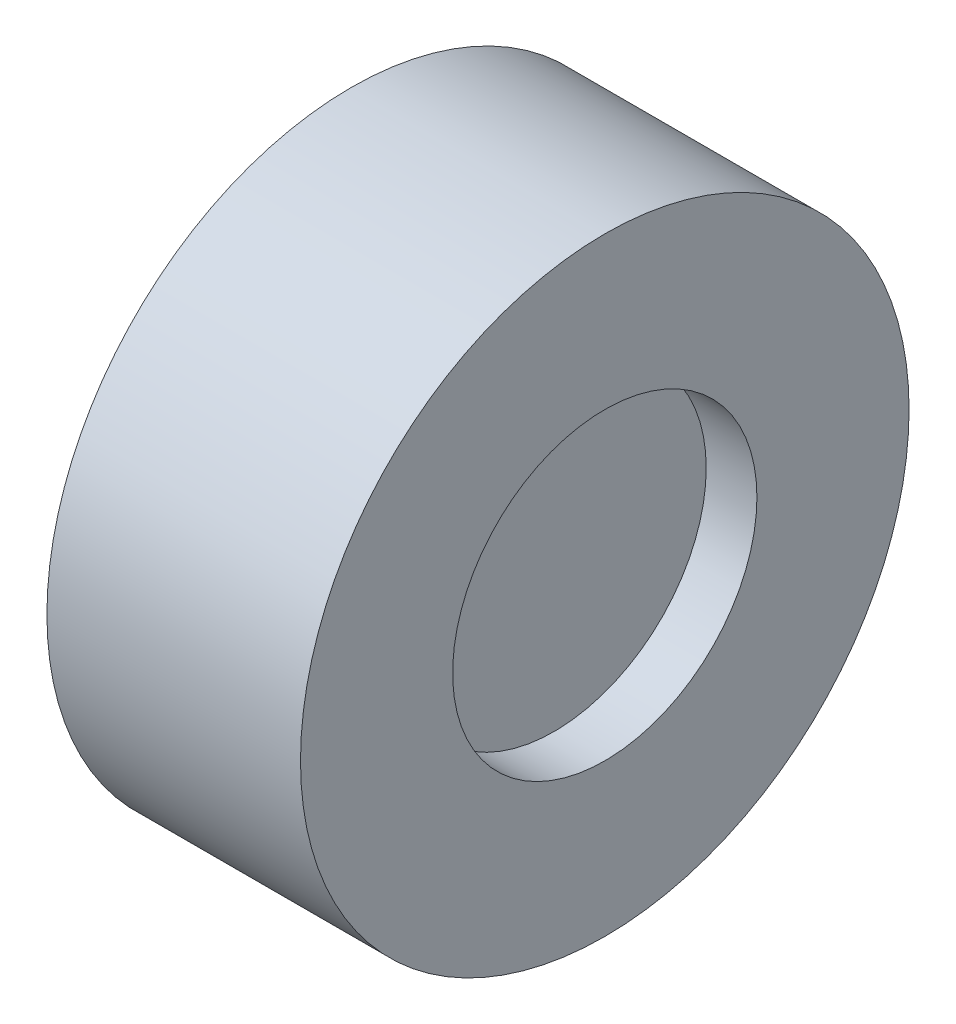
ISO-10303-21;
HEADER;
FILE_DESCRIPTION(('STEP AP214'),'2;1');
FILE_NAME('part.step','',(''),(''),'','','');
FILE_SCHEMA(('AUTOMOTIVE_DESIGN { 1 0 10303 214 1 1 1 1 }'));
ENDSEC;
DATA;
#1=APPLICATION_CONTEXT('core data for automotive mechanical design processes');
#2=APPLICATION_PROTOCOL_DEFINITION('international standard','automotive_design',2000,#1);
#3=PRODUCT_CONTEXT('',#1,'mechanical');
#4=PRODUCT('Part','Part','',(#3));
#5=PRODUCT_RELATED_PRODUCT_CATEGORY('part','',(#4));
#6=PRODUCT_DEFINITION_FORMATION('','',#4);
#7=PRODUCT_DEFINITION_CONTEXT('part definition',#1,'design');
#8=PRODUCT_DEFINITION('design','',#6,#7);
#9=PRODUCT_DEFINITION_SHAPE('','',#8);
#10=(LENGTH_UNIT() NAMED_UNIT(*) SI_UNIT(.MILLI.,.METRE.));
#11=(NAMED_UNIT(*) PLANE_ANGLE_UNIT() SI_UNIT($,.RADIAN.));
#12=(NAMED_UNIT(*) SI_UNIT($,.STERADIAN.) SOLID_ANGLE_UNIT());
#13=UNCERTAINTY_MEASURE_WITH_UNIT(LENGTH_MEASURE(1.E-05),#10,'distance_accuracy_value','');
#14=(GEOMETRIC_REPRESENTATION_CONTEXT(3) GLOBAL_UNCERTAINTY_ASSIGNED_CONTEXT((#13)) GLOBAL_UNIT_ASSIGNED_CONTEXT((#10,
#11,#12)) REPRESENTATION_CONTEXT('',''));
#15=CARTESIAN_POINT('',(0.,0.,0.));
#16=DIRECTION('',(0.,0.,1.));
#17=DIRECTION('',(1.,0.,0.));
#18=AXIS2_PLACEMENT_3D('',#15,#16,#17);
#19=CARTESIAN_POINT('',(10.,0.,0.));
#20=DIRECTION('',(-1.,0.,0.));
#21=DIRECTION('',(0.,0.,1.));
#22=AXIS2_PLACEMENT_3D('',#19,#20,#21);
#23=CYLINDRICAL_SURFACE('',#22,12.);
#24=CARTESIAN_POINT('',(10.,0.,0.));
#25=DIRECTION('',(1.,0.,0.));
#26=DIRECTION('',(0.,0.,-1.));
#27=AXIS2_PLACEMENT_3D('',#24,#25,#26);
#28=CIRCLE('',#27,12.);
#29=CARTESIAN_POINT('',(10.,0.,-12.));
#30=VERTEX_POINT('',#29);
#31=EDGE_CURVE('E10',#30,#30,#28,.T.);
#32=ORIENTED_EDGE('',*,*,#31,.F.);
#33=EDGE_LOOP('',(#32));
#34=FACE_BOUND('',#33,.T.);
#35=CARTESIAN_POINT('',(0.,0.,0.));
#36=DIRECTION('',(1.,0.,0.));
#37=DIRECTION('',(0.,0.,-1.));
#38=AXIS2_PLACEMENT_3D('',#35,#36,#37);
#39=CIRCLE('',#38,12.);
#40=CARTESIAN_POINT('',(0.,0.,-12.));
#41=VERTEX_POINT('',#40);
#42=EDGE_CURVE('E40',#41,#41,#39,.T.);
#43=ORIENTED_EDGE('',*,*,#42,.T.);
#44=EDGE_LOOP('',(#43));
#45=FACE_BOUND('',#44,.T.);
#46=ADVANCED_FACE('F37',(#34,#45),#23,.T.);
#47=CARTESIAN_POINT('',(10.,0.,0.));
#48=DIRECTION('',(1.,0.,0.));
#49=DIRECTION('',(0.,0.,-1.));
#50=AXIS2_PLACEMENT_3D('',#47,#48,#49);
#51=PLANE('',#50);
#52=CARTESIAN_POINT('',(10.,0.,0.));
#53=DIRECTION('',(1.,0.,0.));
#54=DIRECTION('',(0.,0.,-1.));
#55=AXIS2_PLACEMENT_3D('',#52,#53,#54);
#56=CIRCLE('',#55,6.);
#57=CARTESIAN_POINT('',(10.,0.,-6.));
#58=VERTEX_POINT('',#57);
#59=EDGE_CURVE('E55',#58,#58,#56,.T.);
#60=ORIENTED_EDGE('',*,*,#59,.F.);
#61=EDGE_LOOP('',(#60));
#62=FACE_BOUND('',#61,.T.);
#63=ORIENTED_EDGE('',*,*,#31,.T.);
#64=EDGE_LOOP('',(#63));
#65=FACE_BOUND('',#64,.T.);
#66=ADVANCED_FACE('F70',(#62,#65),#51,.T.);
#67=CARTESIAN_POINT('',(0.,0.,0.));
#68=DIRECTION('',(1.,0.,0.));
#69=DIRECTION('',(0.,0.,-1.));
#70=AXIS2_PLACEMENT_3D('',#67,#68,#69);
#71=PLANE('',#70);
#72=CARTESIAN_POINT('',(0.,0.,0.));
#73=DIRECTION('',(-1.,0.,0.));
#74=DIRECTION('',(0.,0.,1.));
#75=AXIS2_PLACEMENT_3D('',#72,#73,#74);
#76=CIRCLE('',#75,1.5);
#77=CARTESIAN_POINT('',(0.,0.,1.5));
#78=VERTEX_POINT('',#77);
#79=EDGE_CURVE('E49',#78,#78,#76,.T.);
#80=ORIENTED_EDGE('',*,*,#79,.F.);
#81=EDGE_LOOP('',(#80));
#82=FACE_BOUND('',#81,.T.);
#83=ORIENTED_EDGE('',*,*,#42,.F.);
#84=EDGE_LOOP('',(#83));
#85=FACE_BOUND('',#84,.T.);
#86=ADVANCED_FACE('F72',(#82,#85),#71,.F.);
#87=CARTESIAN_POINT('',(0.5,0.,0.));
#88=DIRECTION('',(-1.,0.,0.));
#89=DIRECTION('',(0.,0.,1.));
#90=AXIS2_PLACEMENT_3D('',#87,#88,#89);
#91=CYLINDRICAL_SURFACE('',#90,1.5);
#92=CARTESIAN_POINT('',(0.5,0.,0.));
#93=DIRECTION('',(-1.,0.,0.));
#94=DIRECTION('',(0.,0.,1.));
#95=AXIS2_PLACEMENT_3D('',#92,#93,#94);
#96=CIRCLE('',#95,1.5);
#97=CARTESIAN_POINT('',(0.5,0.,1.5));
#98=VERTEX_POINT('',#97);
#99=EDGE_CURVE('E47',#98,#98,#96,.T.);
#100=ORIENTED_EDGE('',*,*,#99,.F.);
#101=EDGE_LOOP('',(#100));
#102=FACE_BOUND('',#101,.T.);
#103=ORIENTED_EDGE('',*,*,#79,.T.);
#104=EDGE_LOOP('',(#103));
#105=FACE_BOUND('',#104,.T.);
#106=ADVANCED_FACE('F78',(#102,#105),#91,.F.);
#107=CARTESIAN_POINT('',(0.5,0.,0.));
#108=DIRECTION('',(-1.,0.,0.));
#109=DIRECTION('',(0.,0.,1.));
#110=AXIS2_PLACEMENT_3D('',#107,#108,#109);
#111=PLANE('',#110);
#112=ORIENTED_EDGE('',*,*,#99,.T.);
#113=EDGE_LOOP('',(#112));
#114=FACE_BOUND('',#113,.T.);
#115=ADVANCED_FACE('F66',(#114),#111,.T.);
#116=CARTESIAN_POINT('',(8.,0.,0.));
#117=DIRECTION('',(1.,0.,0.));
#118=DIRECTION('',(0.,0.,-1.));
#119=AXIS2_PLACEMENT_3D('',#116,#117,#118);
#120=CYLINDRICAL_SURFACE('',#119,6.);
#121=CARTESIAN_POINT('',(8.,0.,0.));
#122=DIRECTION('',(1.,0.,0.));
#123=DIRECTION('',(0.,0.,-1.));
#124=AXIS2_PLACEMENT_3D('',#121,#122,#123);
#125=CIRCLE('',#124,6.);
#126=CARTESIAN_POINT('',(8.,0.,-6.));
#127=VERTEX_POINT('',#126);
#128=EDGE_CURVE('E52',#127,#127,#125,.T.);
#129=ORIENTED_EDGE('',*,*,#128,.F.);
#130=EDGE_LOOP('',(#129));
#131=FACE_BOUND('',#130,.T.);
#132=ORIENTED_EDGE('',*,*,#59,.T.);
#133=EDGE_LOOP('',(#132));
#134=FACE_BOUND('',#133,.T.);
#135=ADVANCED_FACE('F63',(#131,#134),#120,.F.);
#136=CARTESIAN_POINT('',(8.,0.,0.));
#137=DIRECTION('',(1.,0.,0.));
#138=DIRECTION('',(0.,0.,-1.));
#139=AXIS2_PLACEMENT_3D('',#136,#137,#138);
#140=PLANE('',#139);
#141=ORIENTED_EDGE('',*,*,#128,.T.);
#142=EDGE_LOOP('',(#141));
#143=FACE_BOUND('',#142,.T.);
#144=ADVANCED_FACE('F61',(#143),#140,.T.);
#145=CLOSED_SHELL('',(#46,#66,#86,#106,#115,#135,#144));
#146=MANIFOLD_SOLID_BREP('B2',#145);
#147=ADVANCED_BREP_SHAPE_REPRESENTATION('',(#18,#146),#14);
#148=SHAPE_DEFINITION_REPRESENTATION(#9,#147);
ENDSEC;
END-ISO-10303-21;
